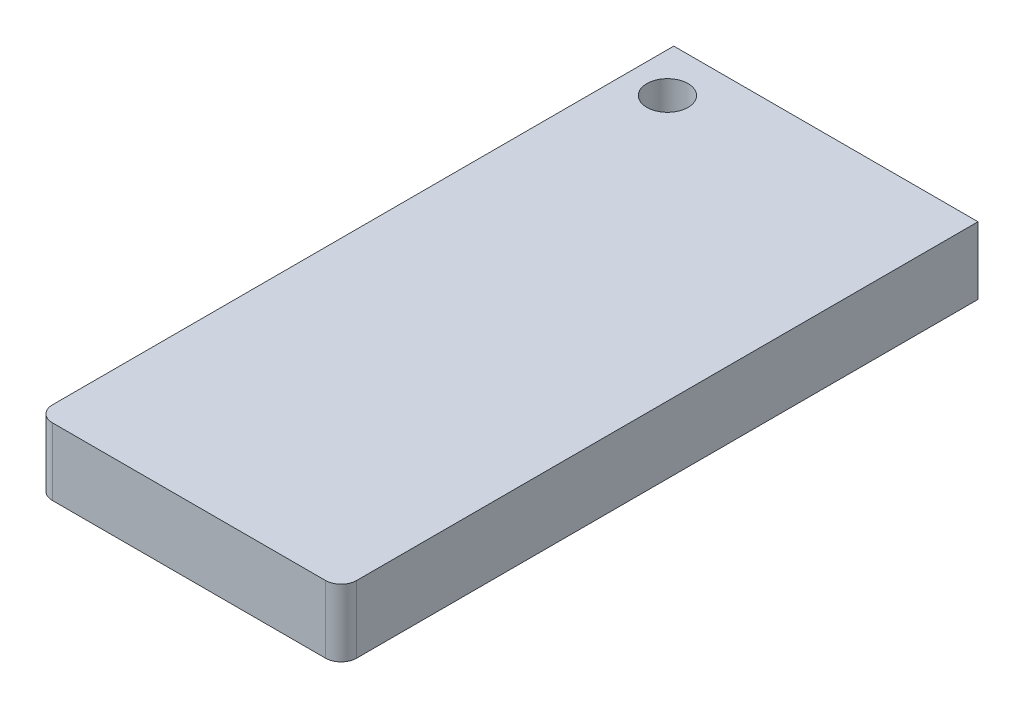
ISO-10303-21;
HEADER;
FILE_DESCRIPTION(('STEP AP214'),'2;1');
FILE_NAME('part.step','',(''),(''),'','','');
FILE_SCHEMA(('AUTOMOTIVE_DESIGN { 1 0 10303 214 1 1 1 1 }'));
ENDSEC;
DATA;
#1=APPLICATION_CONTEXT('core data for automotive mechanical design processes');
#2=APPLICATION_PROTOCOL_DEFINITION('international standard','automotive_design',2000,#1);
#3=PRODUCT_CONTEXT('',#1,'mechanical');
#4=PRODUCT('Part','Part','',(#3));
#5=PRODUCT_RELATED_PRODUCT_CATEGORY('part','',(#4));
#6=PRODUCT_DEFINITION_FORMATION('','',#4);
#7=PRODUCT_DEFINITION_CONTEXT('part definition',#1,'design');
#8=PRODUCT_DEFINITION('design','',#6,#7);
#9=PRODUCT_DEFINITION_SHAPE('','',#8);
#10=(LENGTH_UNIT() NAMED_UNIT(*) SI_UNIT(.MILLI.,.METRE.));
#11=(NAMED_UNIT(*) PLANE_ANGLE_UNIT() SI_UNIT($,.RADIAN.));
#12=(NAMED_UNIT(*) SI_UNIT($,.STERADIAN.) SOLID_ANGLE_UNIT());
#13=UNCERTAINTY_MEASURE_WITH_UNIT(LENGTH_MEASURE(1.E-05),#10,'distance_accuracy_value','');
#14=(GEOMETRIC_REPRESENTATION_CONTEXT(3) GLOBAL_UNCERTAINTY_ASSIGNED_CONTEXT((#13)) GLOBAL_UNIT_ASSIGNED_CONTEXT((#10,
#11,#12)) REPRESENTATION_CONTEXT('',''));
#15=CARTESIAN_POINT('',(0.,0.,0.));
#16=DIRECTION('',(0.,0.,1.));
#17=DIRECTION('',(1.,0.,0.));
#18=AXIS2_PLACEMENT_3D('',#15,#16,#17);
#19=CARTESIAN_POINT('',(29.375,13.,58.5));
#20=DIRECTION('',(-1.,0.,0.));
#21=DIRECTION('',(0.,0.,1.));
#22=AXIS2_PLACEMENT_3D('',#19,#20,#21);
#23=PLANE('',#22);
#24=DIRECTION('',(0.,0.,-1.));
#25=VECTOR('',#24,1.);
#26=CARTESIAN_POINT('',(29.375,0.,58.5));
#27=LINE('',#26,#25);
#28=CARTESIAN_POINT('',(29.375,0.,58.5));
#29=VERTEX_POINT('',#28);
#30=CARTESIAN_POINT('',(29.375,0.,-61.5));
#31=VERTEX_POINT('',#30);
#32=EDGE_CURVE('E122',#29,#31,#27,.T.);
#33=ORIENTED_EDGE('',*,*,#32,.T.);
#34=DIRECTION('',(0.,-1.,0.));
#35=VECTOR('',#34,1.);
#36=CARTESIAN_POINT('',(29.375,13.,-61.5));
#37=LINE('',#36,#35);
#38=CARTESIAN_POINT('',(29.375,13.,-61.5));
#39=VERTEX_POINT('',#38);
#40=EDGE_CURVE('E11',#39,#31,#37,.T.);
#41=ORIENTED_EDGE('',*,*,#40,.F.);
#42=DIRECTION('',(0.,0.,-1.));
#43=VECTOR('',#42,1.);
#44=CARTESIAN_POINT('',(29.375,13.,58.5));
#45=LINE('',#44,#43);
#46=CARTESIAN_POINT('',(29.375,13.,58.5));
#47=VERTEX_POINT('',#46);
#48=EDGE_CURVE('E131',#47,#39,#45,.T.);
#49=ORIENTED_EDGE('',*,*,#48,.F.);
#50=DIRECTION('',(0.,-1.,0.));
#51=VECTOR('',#50,1.);
#52=CARTESIAN_POINT('',(29.375,13.,58.5));
#53=LINE('',#52,#51);
#54=EDGE_CURVE('E116',#47,#29,#53,.T.);
#55=ORIENTED_EDGE('',*,*,#54,.T.);
#56=EDGE_LOOP('',(#33,#41,#49,#55));
#57=FACE_BOUND('',#56,.T.);
#58=ADVANCED_FACE('F39',(#57),#23,.F.);
#59=CARTESIAN_POINT('',(-29.375,13.,-61.5));
#60=DIRECTION('',(0.,0.,1.));
#61=DIRECTION('',(1.,0.,0.));
#62=AXIS2_PLACEMENT_3D('',#59,#60,#61);
#63=PLANE('',#62);
#64=DIRECTION('',(-1.,0.,0.));
#65=VECTOR('',#64,1.);
#66=CARTESIAN_POINT('',(-29.375,0.,-61.5));
#67=LINE('',#66,#65);
#68=CARTESIAN_POINT('',(-29.375,0.,-61.5));
#69=VERTEX_POINT('',#68);
#70=EDGE_CURVE('E127',#31,#69,#67,.T.);
#71=ORIENTED_EDGE('',*,*,#70,.T.);
#72=DIRECTION('',(0.,-1.,0.));
#73=VECTOR('',#72,1.);
#74=CARTESIAN_POINT('',(-29.375,13.,-61.5));
#75=LINE('',#74,#73);
#76=CARTESIAN_POINT('',(-29.375,13.,-61.5));
#77=VERTEX_POINT('',#76);
#78=EDGE_CURVE('E50',#77,#69,#75,.T.);
#79=ORIENTED_EDGE('',*,*,#78,.F.);
#80=DIRECTION('',(-1.,0.,0.));
#81=VECTOR('',#80,1.);
#82=CARTESIAN_POINT('',(-29.375,13.,-61.5));
#83=LINE('',#82,#81);
#84=EDGE_CURVE('E95',#39,#77,#83,.T.);
#85=ORIENTED_EDGE('',*,*,#84,.F.);
#86=ORIENTED_EDGE('',*,*,#40,.T.);
#87=EDGE_LOOP('',(#71,#79,#85,#86));
#88=FACE_BOUND('',#87,.T.);
#89=ADVANCED_FACE('F157',(#88),#63,.F.);
#90=CARTESIAN_POINT('',(-29.375,13.,58.5));
#91=DIRECTION('',(1.,0.,0.));
#92=DIRECTION('',(0.,0.,-1.));
#93=AXIS2_PLACEMENT_3D('',#90,#91,#92);
#94=PLANE('',#93);
#95=DIRECTION('',(0.,0.,1.));
#96=VECTOR('',#95,1.);
#97=CARTESIAN_POINT('',(-29.375,0.,58.5));
#98=LINE('',#97,#96);
#99=CARTESIAN_POINT('',(-29.375,0.,58.5));
#100=VERTEX_POINT('',#99);
#101=EDGE_CURVE('E129',#69,#100,#98,.T.);
#102=ORIENTED_EDGE('',*,*,#101,.T.);
#103=DIRECTION('',(0.,-1.,0.));
#104=VECTOR('',#103,1.);
#105=CARTESIAN_POINT('',(-29.375,13.,58.5));
#106=LINE('',#105,#104);
#107=CARTESIAN_POINT('',(-29.375,13.,58.5));
#108=VERTEX_POINT('',#107);
#109=EDGE_CURVE('E111',#108,#100,#106,.T.);
#110=ORIENTED_EDGE('',*,*,#109,.F.);
#111=DIRECTION('',(0.,0.,1.));
#112=VECTOR('',#111,1.);
#113=CARTESIAN_POINT('',(-29.375,13.,58.5));
#114=LINE('',#113,#112);
#115=EDGE_CURVE('E104',#77,#108,#114,.T.);
#116=ORIENTED_EDGE('',*,*,#115,.F.);
#117=ORIENTED_EDGE('',*,*,#78,.T.);
#118=EDGE_LOOP('',(#102,#110,#116,#117));
#119=FACE_BOUND('',#118,.T.);
#120=ADVANCED_FACE('F136',(#119),#94,.F.);
#121=CARTESIAN_POINT('',(-26.375,13.,58.5));
#122=DIRECTION('',(0.,-1.,0.));
#123=DIRECTION('',(0.,0.,-1.));
#124=AXIS2_PLACEMENT_3D('',#121,#122,#123);
#125=CYLINDRICAL_SURFACE('',#124,3.);
#126=CARTESIAN_POINT('',(-26.375,0.,58.5));
#127=DIRECTION('',(0.,1.,0.));
#128=DIRECTION('',(0.,0.,-1.));
#129=AXIS2_PLACEMENT_3D('',#126,#127,#128);
#130=CIRCLE('',#129,3.);
#131=CARTESIAN_POINT('',(-26.375,0.,61.5));
#132=VERTEX_POINT('',#131);
#133=EDGE_CURVE('E114',#100,#132,#130,.T.);
#134=ORIENTED_EDGE('',*,*,#133,.T.);
#135=DIRECTION('',(0.,-1.,0.));
#136=VECTOR('',#135,1.);
#137=CARTESIAN_POINT('',(-26.375,13.,61.5));
#138=LINE('',#137,#136);
#139=CARTESIAN_POINT('',(-26.375,13.,61.5));
#140=VERTEX_POINT('',#139);
#141=EDGE_CURVE('E109',#140,#132,#138,.T.);
#142=ORIENTED_EDGE('',*,*,#141,.F.);
#143=CARTESIAN_POINT('',(-26.375,13.,58.5));
#144=DIRECTION('',(0.,1.,0.));
#145=DIRECTION('',(0.,0.,-1.));
#146=AXIS2_PLACEMENT_3D('',#143,#144,#145);
#147=CIRCLE('',#146,3.);
#148=EDGE_CURVE('E97',#108,#140,#147,.T.);
#149=ORIENTED_EDGE('',*,*,#148,.F.);
#150=ORIENTED_EDGE('',*,*,#109,.T.);
#151=EDGE_LOOP('',(#134,#142,#149,#150));
#152=FACE_BOUND('',#151,.T.);
#153=ADVANCED_FACE('F112',(#152),#125,.T.);
#154=CARTESIAN_POINT('',(-26.375,13.,61.5));
#155=DIRECTION('',(0.,0.,-1.));
#156=DIRECTION('',(-1.,0.,0.));
#157=AXIS2_PLACEMENT_3D('',#154,#155,#156);
#158=PLANE('',#157);
#159=DIRECTION('',(1.,0.,0.));
#160=VECTOR('',#159,1.);
#161=CARTESIAN_POINT('',(-26.375,0.,61.5));
#162=LINE('',#161,#160);
#163=CARTESIAN_POINT('',(26.375,0.,61.5));
#164=VERTEX_POINT('',#163);
#165=EDGE_CURVE('E79',#132,#164,#162,.T.);
#166=ORIENTED_EDGE('',*,*,#165,.T.);
#167=DIRECTION('',(0.,-1.,0.));
#168=VECTOR('',#167,1.);
#169=CARTESIAN_POINT('',(26.375,13.,61.5));
#170=LINE('',#169,#168);
#171=CARTESIAN_POINT('',(26.375,13.,61.5));
#172=VERTEX_POINT('',#171);
#173=EDGE_CURVE('E113',#172,#164,#170,.T.);
#174=ORIENTED_EDGE('',*,*,#173,.F.);
#175=DIRECTION('',(1.,0.,0.));
#176=VECTOR('',#175,1.);
#177=CARTESIAN_POINT('',(-26.375,13.,61.5));
#178=LINE('',#177,#176);
#179=EDGE_CURVE('E103',#140,#172,#178,.T.);
#180=ORIENTED_EDGE('',*,*,#179,.F.);
#181=ORIENTED_EDGE('',*,*,#141,.T.);
#182=EDGE_LOOP('',(#166,#174,#180,#181));
#183=FACE_BOUND('',#182,.T.);
#184=ADVANCED_FACE('F120',(#183),#158,.F.);
#185=CARTESIAN_POINT('',(26.375,13.,58.5));
#186=DIRECTION('',(0.,-1.,0.));
#187=DIRECTION('',(0.,0.,-1.));
#188=AXIS2_PLACEMENT_3D('',#185,#186,#187);
#189=CYLINDRICAL_SURFACE('',#188,3.);
#190=CARTESIAN_POINT('',(26.375,0.,58.5));
#191=DIRECTION('',(0.,1.,0.));
#192=DIRECTION('',(0.,0.,1.));
#193=AXIS2_PLACEMENT_3D('',#190,#191,#192);
#194=CIRCLE('',#193,3.);
#195=EDGE_CURVE('E85',#164,#29,#194,.T.);
#196=ORIENTED_EDGE('',*,*,#195,.T.);
#197=ORIENTED_EDGE('',*,*,#54,.F.);
#198=CARTESIAN_POINT('',(26.375,13.,58.5));
#199=DIRECTION('',(0.,1.,0.));
#200=DIRECTION('',(0.,0.,1.));
#201=AXIS2_PLACEMENT_3D('',#198,#199,#200);
#202=CIRCLE('',#201,3.);
#203=EDGE_CURVE('E54',#172,#47,#202,.T.);
#204=ORIENTED_EDGE('',*,*,#203,.F.);
#205=ORIENTED_EDGE('',*,*,#173,.T.);
#206=EDGE_LOOP('',(#196,#197,#204,#205));
#207=FACE_BOUND('',#206,.T.);
#208=ADVANCED_FACE('F150',(#207),#189,.T.);
#209=CARTESIAN_POINT('',(-26.375,13.,58.5));
#210=DIRECTION('',(0.,-1.,0.));
#211=DIRECTION('',(0.,0.,-1.));
#212=AXIS2_PLACEMENT_3D('',#209,#210,#211);
#213=PLANE('',#212);
#214=CARTESIAN_POINT('',(-21.7248268457709,13.,-52.6252020957684));
#215=DIRECTION('',(0.,1.,0.));
#216=DIRECTION('',(0.,0.,1.));
#217=AXIS2_PLACEMENT_3D('',#214,#215,#216);
#218=CIRCLE('',#217,3.9848325339985);
#219=CARTESIAN_POINT('',(-21.7248268457709,13.,-48.6403695617699));
#220=VERTEX_POINT('',#219);
#221=EDGE_CURVE('E214',#220,#220,#218,.T.);
#222=ORIENTED_EDGE('',*,*,#221,.F.);
#223=EDGE_LOOP('',(#222));
#224=FACE_BOUND('',#223,.T.);
#225=ORIENTED_EDGE('',*,*,#48,.T.);
#226=ORIENTED_EDGE('',*,*,#84,.T.);
#227=ORIENTED_EDGE('',*,*,#115,.T.);
#228=ORIENTED_EDGE('',*,*,#148,.T.);
#229=ORIENTED_EDGE('',*,*,#179,.T.);
#230=ORIENTED_EDGE('',*,*,#203,.T.);
#231=EDGE_LOOP('',(#225,#226,#227,#228,#229,#230));
#232=FACE_BOUND('',#231,.T.);
#233=ADVANCED_FACE('F101',(#224,#232),#213,.F.);
#234=CARTESIAN_POINT('',(-26.375,0.,58.5));
#235=DIRECTION('',(0.,-1.,0.));
#236=DIRECTION('',(0.,0.,-1.));
#237=AXIS2_PLACEMENT_3D('',#234,#235,#236);
#238=PLANE('',#237);
#239=CARTESIAN_POINT('',(-21.7248268457709,0.,-52.6252020957684));
#240=DIRECTION('',(0.,1.,0.));
#241=DIRECTION('',(0.,0.,1.));
#242=AXIS2_PLACEMENT_3D('',#239,#240,#241);
#243=CIRCLE('',#242,3.9848325339985);
#244=CARTESIAN_POINT('',(-21.7248268457709,0.,-48.6403695617699));
#245=VERTEX_POINT('',#244);
#246=EDGE_CURVE('E130',#245,#245,#243,.T.);
#247=ORIENTED_EDGE('',*,*,#246,.T.);
#248=EDGE_LOOP('',(#247));
#249=FACE_BOUND('',#248,.T.);
#250=ORIENTED_EDGE('',*,*,#32,.F.);
#251=ORIENTED_EDGE('',*,*,#195,.F.);
#252=ORIENTED_EDGE('',*,*,#165,.F.);
#253=ORIENTED_EDGE('',*,*,#133,.F.);
#254=ORIENTED_EDGE('',*,*,#101,.F.);
#255=ORIENTED_EDGE('',*,*,#70,.F.);
#256=EDGE_LOOP('',(#250,#251,#252,#253,#254,#255));
#257=FACE_BOUND('',#256,.T.);
#258=ADVANCED_FACE('F141',(#249,#257),#238,.T.);
#259=CARTESIAN_POINT('',(-21.7248268457709,0.,-52.6252020957684));
#260=DIRECTION('',(0.,1.,0.));
#261=DIRECTION('',(0.,0.,1.));
#262=AXIS2_PLACEMENT_3D('',#259,#260,#261);
#263=CYLINDRICAL_SURFACE('',#262,3.9848325339985);
#264=CARTESIAN_POINT('',(-21.7248268457709,0.,-48.6403695617699));
#265=CARTESIAN_POINT('',(-21.7248268457709,0.135416666666666,-48.6403695617699));
#266=CARTESIAN_POINT('',(-21.7248268457709,0.270833333333333,-48.6403695617699));
#267=CARTESIAN_POINT('',(-21.7248268457709,0.541666666666667,-48.6403695617699));
#268=CARTESIAN_POINT('',(-21.7248268457709,0.677083333333333,-48.6403695617699));
#269=CARTESIAN_POINT('',(-21.7248268457709,0.947916666666667,-48.6403695617699));
#270=CARTESIAN_POINT('',(-21.7248268457709,1.08333333333333,-48.6403695617699));
#271=CARTESIAN_POINT('',(-21.7248268457709,1.35416666666667,-48.6403695617699));
#272=CARTESIAN_POINT('',(-21.7248268457709,1.48958333333333,-48.6403695617699));
#273=CARTESIAN_POINT('',(-21.7248268457709,1.76041666666667,-48.6403695617699));
#274=CARTESIAN_POINT('',(-21.7248268457709,1.89583333333333,-48.6403695617699));
#275=CARTESIAN_POINT('',(-21.7248268457709,2.16666666666667,-48.6403695617699));
#276=CARTESIAN_POINT('',(-21.7248268457709,2.30208333333333,-48.6403695617699));
#277=CARTESIAN_POINT('',(-21.7248268457709,2.57291666666667,-48.6403695617699));
#278=CARTESIAN_POINT('',(-21.7248268457709,2.70833333333333,-48.6403695617699));
#279=CARTESIAN_POINT('',(-21.7248268457709,2.97916666666667,-48.6403695617699));
#280=CARTESIAN_POINT('',(-21.7248268457709,3.11458333333333,-48.6403695617699));
#281=CARTESIAN_POINT('',(-21.7248268457709,3.38541666666667,-48.6403695617699));
#282=CARTESIAN_POINT('',(-21.7248268457709,3.52083333333333,-48.6403695617699));
#283=CARTESIAN_POINT('',(-21.7248268457709,3.79166666666667,-48.6403695617699));
#284=CARTESIAN_POINT('',(-21.7248268457709,3.92708333333333,-48.6403695617699));
#285=CARTESIAN_POINT('',(-21.7248268457709,4.19791666666667,-48.6403695617699));
#286=CARTESIAN_POINT('',(-21.7248268457709,4.33333333333333,-48.6403695617699));
#287=CARTESIAN_POINT('',(-21.7248268457709,4.60416666666667,-48.6403695617699));
#288=CARTESIAN_POINT('',(-21.7248268457709,4.73958333333333,-48.6403695617699));
#289=CARTESIAN_POINT('',(-21.7248268457709,5.01041666666667,-48.6403695617699));
#290=CARTESIAN_POINT('',(-21.7248268457709,5.14583333333333,-48.6403695617699));
#291=CARTESIAN_POINT('',(-21.7248268457709,5.41666666666667,-48.6403695617699));
#292=CARTESIAN_POINT('',(-21.7248268457709,5.55208333333333,-48.6403695617699));
#293=CARTESIAN_POINT('',(-21.7248268457709,5.82291666666667,-48.6403695617699));
#294=CARTESIAN_POINT('',(-21.7248268457709,5.95833333333333,-48.6403695617699));
#295=CARTESIAN_POINT('',(-21.7248268457709,6.22916666666667,-48.6403695617699));
#296=CARTESIAN_POINT('',(-21.7248268457709,6.36458333333333,-48.6403695617699));
#297=CARTESIAN_POINT('',(-21.7248268457709,6.63541666666667,-48.6403695617699));
#298=CARTESIAN_POINT('',(-21.7248268457709,6.77083333333333,-48.6403695617699));
#299=CARTESIAN_POINT('',(-21.7248268457709,7.04166666666667,-48.6403695617699));
#300=CARTESIAN_POINT('',(-21.7248268457709,7.17708333333333,-48.6403695617699));
#301=CARTESIAN_POINT('',(-21.7248268457709,7.44791666666667,-48.6403695617699));
#302=CARTESIAN_POINT('',(-21.7248268457709,7.58333333333333,-48.6403695617699));
#303=CARTESIAN_POINT('',(-21.7248268457709,7.85416666666667,-48.6403695617699));
#304=CARTESIAN_POINT('',(-21.7248268457709,7.98958333333333,-48.6403695617699));
#305=CARTESIAN_POINT('',(-21.7248268457709,8.26041666666667,-48.6403695617699));
#306=CARTESIAN_POINT('',(-21.7248268457709,8.39583333333333,-48.6403695617699));
#307=CARTESIAN_POINT('',(-21.7248268457709,8.66666666666667,-48.6403695617699));
#308=CARTESIAN_POINT('',(-21.7248268457709,8.80208333333333,-48.6403695617699));
#309=CARTESIAN_POINT('',(-21.7248268457709,9.07291666666667,-48.6403695617699));
#310=CARTESIAN_POINT('',(-21.7248268457709,9.20833333333333,-48.6403695617699));
#311=CARTESIAN_POINT('',(-21.7248268457709,9.47916666666667,-48.6403695617699));
#312=CARTESIAN_POINT('',(-21.7248268457709,9.61458333333333,-48.6403695617699));
#313=CARTESIAN_POINT('',(-21.7248268457709,9.88541666666667,-48.6403695617699));
#314=CARTESIAN_POINT('',(-21.7248268457709,10.0208333333333,-48.6403695617699));
#315=CARTESIAN_POINT('',(-21.7248268457709,10.2916666666667,-48.6403695617699));
#316=CARTESIAN_POINT('',(-21.7248268457709,10.4270833333333,-48.6403695617699));
#317=CARTESIAN_POINT('',(-21.7248268457709,10.6979166666667,-48.6403695617699));
#318=CARTESIAN_POINT('',(-21.7248268457709,10.8333333333333,-48.6403695617699));
#319=CARTESIAN_POINT('',(-21.7248268457709,11.1041666666667,-48.6403695617699));
#320=CARTESIAN_POINT('',(-21.7248268457709,11.2395833333333,-48.6403695617699));
#321=CARTESIAN_POINT('',(-21.7248268457709,11.5104166666667,-48.6403695617699));
#322=CARTESIAN_POINT('',(-21.7248268457709,11.6458333333333,-48.6403695617699));
#323=CARTESIAN_POINT('',(-21.7248268457709,11.9166666666667,-48.6403695617699));
#324=CARTESIAN_POINT('',(-21.7248268457709,12.0520833333333,-48.6403695617699));
#325=CARTESIAN_POINT('',(-21.7248268457709,12.3229166666667,-48.6403695617699));
#326=CARTESIAN_POINT('',(-21.7248268457709,12.4583333333333,-48.6403695617699));
#327=CARTESIAN_POINT('',(-21.7248268457709,12.7291666666667,-48.6403695617699));
#328=CARTESIAN_POINT('',(-21.7248268457709,12.8645833333333,-48.6403695617699));
#329=CARTESIAN_POINT('',(-21.7248268457709,13.,-48.6403695617699));
#330=B_SPLINE_CURVE_WITH_KNOTS('',3,(#264,#265,#266,#267,#268,#269,#270,#271,#272,#273,#274,
#275,#276,#277,#278,#279,#280,#281,#282,#283,#284,#285,#286,#287,#288,#289,#290,#291,#292,#293,
#294,#295,#296,#297,#298,#299,#300,#301,#302,#303,#304,#305,#306,#307,#308,#309,#310,#311,#312,
#313,#314,#315,#316,#317,#318,#319,#320,#321,#322,#323,#324,#325,#326,#327,#328,#329),
.UNSPECIFIED.,.F.,.F.,(4,2,2,2,2,2,2,2,2,2,2,2,2,2,2,2,2,2,2,2,2,2,2,2,2,2,2,2,2,2,2,2,4),(0.,
0.40625,0.8125,1.21875,1.625,2.03125,2.4375,2.84375,3.25,3.65625,4.0625,4.46875,4.875,5.28125,
5.6875,6.09375,6.5,6.90625,7.3125,7.71875,8.125,8.53125,8.9375,9.34375,9.75,10.15625,10.5625,
10.96875,11.375,11.78125,12.1875,12.59375,13.),.UNSPECIFIED.);
#331=EDGE_CURVE('BSEAM196',#245,#220,#330,.T.);
#332=ORIENTED_EDGE('',*,*,#246,.F.);
#333=ORIENTED_EDGE('',*,*,#221,.T.);
#334=ORIENTED_EDGE('',*,*,#331,.T.);
#335=ORIENTED_EDGE('',*,*,#331,.F.);
#336=EDGE_LOOP('',(#332,#334,#333,#335));
#337=FACE_BOUND('',#336,.T.);
#338=ADVANCED_FACE('F196',(#337),#263,.F.);
#339=CLOSED_SHELL('',(#58,#89,#120,#153,#184,#208,#233,#258,#338));
#340=MANIFOLD_SOLID_BREP('B2',#339);
#341=ADVANCED_BREP_SHAPE_REPRESENTATION('',(#18,#340),#14);
#342=SHAPE_DEFINITION_REPRESENTATION(#9,#341);
ENDSEC;
END-ISO-10303-21;
